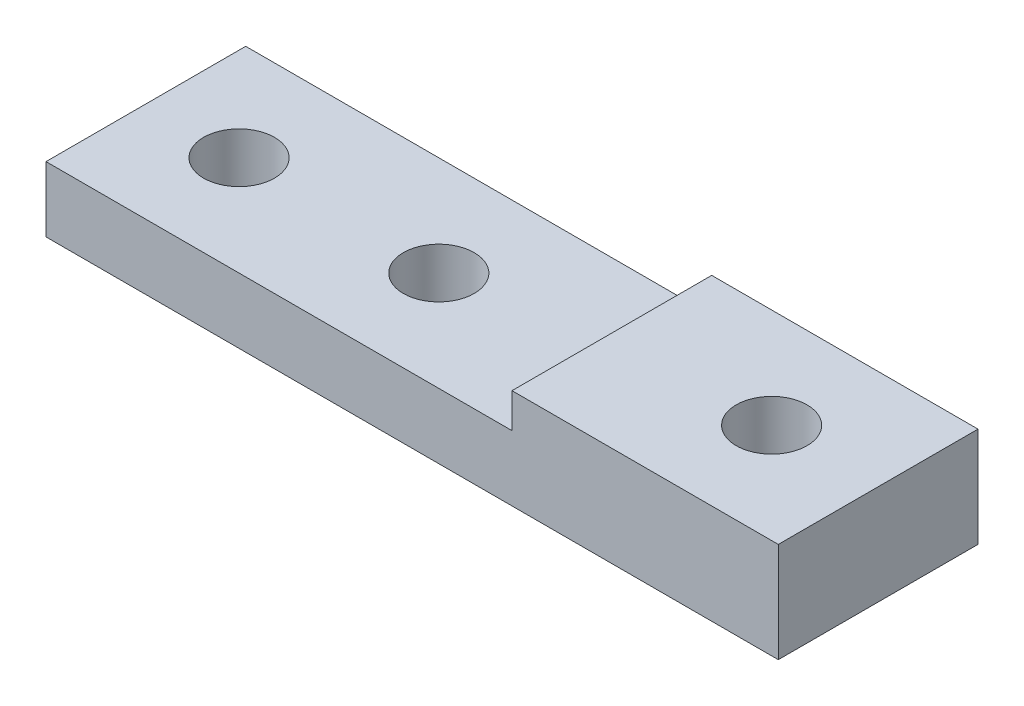
ISO-10303-21;
HEADER;
FILE_DESCRIPTION(('STEP AP214'),'2;1');
FILE_NAME('part.step','',(''),(''),'','','');
FILE_SCHEMA(('AUTOMOTIVE_DESIGN { 1 0 10303 214 1 1 1 1 }'));
ENDSEC;
DATA;
#1=APPLICATION_CONTEXT('core data for automotive mechanical design processes');
#2=APPLICATION_PROTOCOL_DEFINITION('international standard','automotive_design',2000,#1);
#3=PRODUCT_CONTEXT('',#1,'mechanical');
#4=PRODUCT('Part','Part','',(#3));
#5=PRODUCT_RELATED_PRODUCT_CATEGORY('part','',(#4));
#6=PRODUCT_DEFINITION_FORMATION('','',#4);
#7=PRODUCT_DEFINITION_CONTEXT('part definition',#1,'design');
#8=PRODUCT_DEFINITION('design','',#6,#7);
#9=PRODUCT_DEFINITION_SHAPE('','',#8);
#10=(LENGTH_UNIT() NAMED_UNIT(*) SI_UNIT(.MILLI.,.METRE.));
#11=(NAMED_UNIT(*) PLANE_ANGLE_UNIT() SI_UNIT($,.RADIAN.));
#12=(NAMED_UNIT(*) SI_UNIT($,.STERADIAN.) SOLID_ANGLE_UNIT());
#13=UNCERTAINTY_MEASURE_WITH_UNIT(LENGTH_MEASURE(1.E-05),#10,'distance_accuracy_value','');
#14=(GEOMETRIC_REPRESENTATION_CONTEXT(3) GLOBAL_UNCERTAINTY_ASSIGNED_CONTEXT((#13)) GLOBAL_UNIT_ASSIGNED_CONTEXT((#10,
#11,#12)) REPRESENTATION_CONTEXT('',''));
#15=CARTESIAN_POINT('',(0.,0.,0.));
#16=DIRECTION('',(0.,0.,1.));
#17=DIRECTION('',(1.,0.,0.));
#18=AXIS2_PLACEMENT_3D('',#15,#16,#17);
#19=CARTESIAN_POINT('',(-34.925,6.223,-9.525));
#20=DIRECTION('',(1.,0.,0.));
#21=DIRECTION('',(0.,0.,-1.));
#22=AXIS2_PLACEMENT_3D('',#19,#20,#21);
#23=PLANE('',#22);
#24=DIRECTION('',(0.,0.,1.));
#25=VECTOR('',#24,1.);
#26=CARTESIAN_POINT('',(-34.925,0.,-9.525));
#27=LINE('',#26,#25);
#28=CARTESIAN_POINT('',(-34.925,0.,-9.525));
#29=VERTEX_POINT('',#28);
#30=CARTESIAN_POINT('',(-34.925,0.,9.525));
#31=VERTEX_POINT('',#30);
#32=EDGE_CURVE('E101',#29,#31,#27,.T.);
#33=ORIENTED_EDGE('',*,*,#32,.T.);
#34=DIRECTION('',(0.,-1.,0.));
#35=VECTOR('',#34,1.);
#36=CARTESIAN_POINT('',(-34.925,6.223,9.525));
#37=LINE('',#36,#35);
#38=CARTESIAN_POINT('',(-34.925,6.223,9.525));
#39=VERTEX_POINT('',#38);
#40=EDGE_CURVE('E11',#39,#31,#37,.T.);
#41=ORIENTED_EDGE('',*,*,#40,.F.);
#42=DIRECTION('',(0.,0.,1.));
#43=VECTOR('',#42,1.);
#44=CARTESIAN_POINT('',(-34.925,6.223,-9.525));
#45=LINE('',#44,#43);
#46=CARTESIAN_POINT('',(-34.925,6.223,-9.525));
#47=VERTEX_POINT('',#46);
#48=EDGE_CURVE('E95',#47,#39,#45,.T.);
#49=ORIENTED_EDGE('',*,*,#48,.F.);
#50=DIRECTION('',(0.,-1.,0.));
#51=VECTOR('',#50,1.);
#52=CARTESIAN_POINT('',(-34.925,6.223,-9.525));
#53=LINE('',#52,#51);
#54=EDGE_CURVE('E86',#47,#29,#53,.T.);
#55=ORIENTED_EDGE('',*,*,#54,.T.);
#56=EDGE_LOOP('',(#33,#41,#49,#55));
#57=FACE_BOUND('',#56,.T.);
#58=ADVANCED_FACE('F43',(#57),#23,.F.);
#59=CARTESIAN_POINT('',(-34.925,6.223,9.525));
#60=DIRECTION('',(0.,0.,-1.));
#61=DIRECTION('',(-1.,0.,0.));
#62=AXIS2_PLACEMENT_3D('',#59,#60,#61);
#63=PLANE('',#62);
#64=DIRECTION('',(1.,0.,0.));
#65=VECTOR('',#64,1.);
#66=CARTESIAN_POINT('',(-34.925,0.,9.525));
#67=LINE('',#66,#65);
#68=CARTESIAN_POINT('',(34.925,0.,9.525));
#69=VERTEX_POINT('',#68);
#70=EDGE_CURVE('E105',#31,#69,#67,.T.);
#71=ORIENTED_EDGE('',*,*,#70,.T.);
#72=DIRECTION('',(0.,-1.,0.));
#73=VECTOR('',#72,1.);
#74=CARTESIAN_POINT('',(34.925,6.223,9.525));
#75=LINE('',#74,#73);
#76=CARTESIAN_POINT('',(34.925,9.525,9.525));
#77=VERTEX_POINT('',#76);
#78=EDGE_CURVE('E51',#77,#69,#75,.T.);
#79=ORIENTED_EDGE('',*,*,#78,.F.);
#80=DIRECTION('',(1.,0.,0.));
#81=VECTOR('',#80,1.);
#82=CARTESIAN_POINT('',(34.925,9.525,9.525));
#83=LINE('',#82,#81);
#84=CARTESIAN_POINT('',(9.52500000000001,9.525,9.525));
#85=VERTEX_POINT('',#84);
#86=EDGE_CURVE('E137',#85,#77,#83,.T.);
#87=ORIENTED_EDGE('',*,*,#86,.F.);
#88=DIRECTION('',(0.,-1.,0.));
#89=VECTOR('',#88,1.);
#90=CARTESIAN_POINT('',(9.52500000000001,9.525,9.525));
#91=LINE('',#90,#89);
#92=CARTESIAN_POINT('',(9.52500000000001,6.223,9.525));
#93=VERTEX_POINT('',#92);
#94=EDGE_CURVE('E114',#85,#93,#91,.T.);
#95=ORIENTED_EDGE('',*,*,#94,.T.);
#96=DIRECTION('',(1.,0.,0.));
#97=VECTOR('',#96,1.);
#98=CARTESIAN_POINT('',(-34.925,6.223,9.525));
#99=LINE('',#98,#97);
#100=EDGE_CURVE('E161',#39,#93,#99,.T.);
#101=ORIENTED_EDGE('',*,*,#100,.F.);
#102=ORIENTED_EDGE('',*,*,#40,.T.);
#103=EDGE_LOOP('',(#71,#79,#87,#95,#101,#102));
#104=FACE_BOUND('',#103,.T.);
#105=ADVANCED_FACE('F134',(#104),#63,.F.);
#106=CARTESIAN_POINT('',(34.925,6.223,-9.525));
#107=DIRECTION('',(-1.,0.,0.));
#108=DIRECTION('',(0.,0.,1.));
#109=AXIS2_PLACEMENT_3D('',#106,#107,#108);
#110=PLANE('',#109);
#111=DIRECTION('',(0.,0.,-1.));
#112=VECTOR('',#111,1.);
#113=CARTESIAN_POINT('',(34.925,0.,-9.525));
#114=LINE('',#113,#112);
#115=CARTESIAN_POINT('',(34.925,0.,-9.525));
#116=VERTEX_POINT('',#115);
#117=EDGE_CURVE('E96',#69,#116,#114,.T.);
#118=ORIENTED_EDGE('',*,*,#117,.T.);
#119=DIRECTION('',(0.,-1.,0.));
#120=VECTOR('',#119,1.);
#121=CARTESIAN_POINT('',(34.925,6.223,-9.525));
#122=LINE('',#121,#120);
#123=CARTESIAN_POINT('',(34.925,9.525,-9.525));
#124=VERTEX_POINT('',#123);
#125=EDGE_CURVE('E90',#124,#116,#122,.T.);
#126=ORIENTED_EDGE('',*,*,#125,.F.);
#127=DIRECTION('',(0.,0.,-1.));
#128=VECTOR('',#127,1.);
#129=CARTESIAN_POINT('',(34.925,9.525,-9.525));
#130=LINE('',#129,#128);
#131=EDGE_CURVE('E130',#77,#124,#130,.T.);
#132=ORIENTED_EDGE('',*,*,#131,.F.);
#133=ORIENTED_EDGE('',*,*,#78,.T.);
#134=EDGE_LOOP('',(#118,#126,#132,#133));
#135=FACE_BOUND('',#134,.T.);
#136=ADVANCED_FACE('F128',(#135),#110,.F.);
#137=CARTESIAN_POINT('',(-34.925,6.223,-9.525));
#138=DIRECTION('',(0.,0.,1.));
#139=DIRECTION('',(1.,0.,0.));
#140=AXIS2_PLACEMENT_3D('',#137,#138,#139);
#141=PLANE('',#140);
#142=DIRECTION('',(-1.,0.,0.));
#143=VECTOR('',#142,1.);
#144=CARTESIAN_POINT('',(-34.925,0.,-9.525));
#145=LINE('',#144,#143);
#146=EDGE_CURVE('E83',#116,#29,#145,.T.);
#147=ORIENTED_EDGE('',*,*,#146,.T.);
#148=ORIENTED_EDGE('',*,*,#54,.F.);
#149=DIRECTION('',(-1.,0.,0.));
#150=VECTOR('',#149,1.);
#151=CARTESIAN_POINT('',(-34.925,6.223,-9.525));
#152=LINE('',#151,#150);
#153=CARTESIAN_POINT('',(9.52500000000001,6.223,-9.525));
#154=VERTEX_POINT('',#153);
#155=EDGE_CURVE('E63',#154,#47,#152,.T.);
#156=ORIENTED_EDGE('',*,*,#155,.F.);
#157=DIRECTION('',(0.,-1.,0.));
#158=VECTOR('',#157,1.);
#159=CARTESIAN_POINT('',(9.52500000000001,9.525,-9.525));
#160=LINE('',#159,#158);
#161=CARTESIAN_POINT('',(9.52500000000001,9.525,-9.525));
#162=VERTEX_POINT('',#161);
#163=EDGE_CURVE('E107',#162,#154,#160,.T.);
#164=ORIENTED_EDGE('',*,*,#163,.F.);
#165=DIRECTION('',(-1.,0.,0.));
#166=VECTOR('',#165,1.);
#167=CARTESIAN_POINT('',(34.925,9.525,-9.525));
#168=LINE('',#167,#166);
#169=EDGE_CURVE('E153',#124,#162,#168,.T.);
#170=ORIENTED_EDGE('',*,*,#169,.F.);
#171=ORIENTED_EDGE('',*,*,#125,.T.);
#172=EDGE_LOOP('',(#147,#148,#156,#164,#170,#171));
#173=FACE_BOUND('',#172,.T.);
#174=ADVANCED_FACE('F85',(#173),#141,.F.);
#175=CARTESIAN_POINT('',(0.,6.223,0.));
#176=DIRECTION('',(0.,1.,0.));
#177=DIRECTION('',(0.,0.,1.));
#178=AXIS2_PLACEMENT_3D('',#175,#176,#177);
#179=PLANE('',#178);
#180=CARTESIAN_POINT('',(-6.98499999999999,6.223,0.));
#181=DIRECTION('',(0.,1.,0.));
#182=DIRECTION('',(0.,0.,1.));
#183=AXIS2_PLACEMENT_3D('',#180,#181,#182);
#184=CIRCLE('',#183,3.3782);
#185=CARTESIAN_POINT('',(-6.98499999999999,6.223,3.3782));
#186=VERTEX_POINT('',#185);
#187=EDGE_CURVE('E189',#186,#186,#184,.T.);
#188=ORIENTED_EDGE('',*,*,#187,.F.);
#189=EDGE_LOOP('',(#188));
#190=FACE_BOUND('',#189,.T.);
#191=CARTESIAN_POINT('',(-26.035,6.223,0.));
#192=DIRECTION('',(0.,1.,0.));
#193=DIRECTION('',(0.,0.,1.));
#194=AXIS2_PLACEMENT_3D('',#191,#192,#193);
#195=CIRCLE('',#194,3.3782);
#196=CARTESIAN_POINT('',(-26.035,6.223,3.3782));
#197=VERTEX_POINT('',#196);
#198=EDGE_CURVE('E158',#197,#197,#195,.T.);
#199=ORIENTED_EDGE('',*,*,#198,.F.);
#200=EDGE_LOOP('',(#199));
#201=FACE_BOUND('',#200,.T.);
#202=DIRECTION('',(0.,0.,1.));
#203=VECTOR('',#202,1.);
#204=CARTESIAN_POINT('',(9.52500000000001,6.223,-9.525));
#205=LINE('',#204,#203);
#206=EDGE_CURVE('E58',#154,#93,#205,.T.);
#207=ORIENTED_EDGE('',*,*,#206,.F.);
#208=ORIENTED_EDGE('',*,*,#155,.T.);
#209=ORIENTED_EDGE('',*,*,#48,.T.);
#210=ORIENTED_EDGE('',*,*,#100,.T.);
#211=EDGE_LOOP('',(#207,#208,#209,#210));
#212=FACE_BOUND('',#211,.T.);
#213=ADVANCED_FACE('F169',(#190,#201,#212),#179,.T.);
#214=CARTESIAN_POINT('',(0.,0.,0.));
#215=DIRECTION('',(0.,1.,0.));
#216=DIRECTION('',(0.,0.,1.));
#217=AXIS2_PLACEMENT_3D('',#214,#215,#216);
#218=PLANE('',#217);
#219=CARTESIAN_POINT('',(24.765,0.,0.));
#220=DIRECTION('',(0.,-1.,0.));
#221=DIRECTION('',(0.,0.,-1.));
#222=AXIS2_PLACEMENT_3D('',#219,#220,#221);
#223=CIRCLE('',#222,3.3782);
#224=CARTESIAN_POINT('',(24.765,0.,-3.3782));
#225=VERTEX_POINT('',#224);
#226=EDGE_CURVE('E201',#225,#225,#223,.T.);
#227=ORIENTED_EDGE('',*,*,#226,.F.);
#228=EDGE_LOOP('',(#227));
#229=FACE_BOUND('',#228,.T.);
#230=CARTESIAN_POINT('',(-6.98499999999999,0.,0.));
#231=DIRECTION('',(0.,-1.,0.));
#232=DIRECTION('',(0.,0.,-1.));
#233=AXIS2_PLACEMENT_3D('',#230,#231,#232);
#234=CIRCLE('',#233,3.3782);
#235=CARTESIAN_POINT('',(-6.98499999999999,0.,-3.3782));
#236=VERTEX_POINT('',#235);
#237=EDGE_CURVE('E193',#236,#236,#234,.T.);
#238=ORIENTED_EDGE('',*,*,#237,.F.);
#239=EDGE_LOOP('',(#238));
#240=FACE_BOUND('',#239,.T.);
#241=CARTESIAN_POINT('',(-26.035,0.,0.));
#242=DIRECTION('',(0.,-1.,0.));
#243=DIRECTION('',(0.,0.,-1.));
#244=AXIS2_PLACEMENT_3D('',#241,#242,#243);
#245=CIRCLE('',#244,3.3782);
#246=CARTESIAN_POINT('',(-26.035,0.,-3.3782));
#247=VERTEX_POINT('',#246);
#248=EDGE_CURVE('E185',#247,#247,#245,.T.);
#249=ORIENTED_EDGE('',*,*,#248,.F.);
#250=EDGE_LOOP('',(#249));
#251=FACE_BOUND('',#250,.T.);
#252=ORIENTED_EDGE('',*,*,#32,.F.);
#253=ORIENTED_EDGE('',*,*,#146,.F.);
#254=ORIENTED_EDGE('',*,*,#117,.F.);
#255=ORIENTED_EDGE('',*,*,#70,.F.);
#256=EDGE_LOOP('',(#252,#253,#254,#255));
#257=FACE_BOUND('',#256,.T.);
#258=ADVANCED_FACE('F104',(#229,#240,#251,#257),#218,.F.);
#259=CARTESIAN_POINT('',(9.52500000000001,9.525,-9.525));
#260=DIRECTION('',(1.,0.,0.));
#261=DIRECTION('',(0.,0.,-1.));
#262=AXIS2_PLACEMENT_3D('',#259,#260,#261);
#263=PLANE('',#262);
#264=ORIENTED_EDGE('',*,*,#206,.T.);
#265=ORIENTED_EDGE('',*,*,#94,.F.);
#266=DIRECTION('',(0.,0.,1.));
#267=VECTOR('',#266,1.);
#268=CARTESIAN_POINT('',(9.52500000000001,9.525,-9.525));
#269=LINE('',#268,#267);
#270=EDGE_CURVE('E145',#162,#85,#269,.T.);
#271=ORIENTED_EDGE('',*,*,#270,.F.);
#272=ORIENTED_EDGE('',*,*,#163,.T.);
#273=EDGE_LOOP('',(#264,#265,#271,#272));
#274=FACE_BOUND('',#273,.T.);
#275=ADVANCED_FACE('F171',(#274),#263,.F.);
#276=CARTESIAN_POINT('',(0.,9.525,0.));
#277=DIRECTION('',(0.,-1.,0.));
#278=DIRECTION('',(0.,0.,-1.));
#279=AXIS2_PLACEMENT_3D('',#276,#277,#278);
#280=PLANE('',#279);
#281=CARTESIAN_POINT('',(24.765,9.525,0.));
#282=DIRECTION('',(0.,-1.,0.));
#283=DIRECTION('',(0.,0.,-1.));
#284=AXIS2_PLACEMENT_3D('',#281,#282,#283);
#285=CIRCLE('',#284,3.3782);
#286=CARTESIAN_POINT('',(24.765,9.525,-3.3782));
#287=VERTEX_POINT('',#286);
#288=EDGE_CURVE('E197',#287,#287,#285,.T.);
#289=ORIENTED_EDGE('',*,*,#288,.T.);
#290=EDGE_LOOP('',(#289));
#291=FACE_BOUND('',#290,.T.);
#292=ORIENTED_EDGE('',*,*,#131,.T.);
#293=ORIENTED_EDGE('',*,*,#169,.T.);
#294=ORIENTED_EDGE('',*,*,#270,.T.);
#295=ORIENTED_EDGE('',*,*,#86,.T.);
#296=EDGE_LOOP('',(#292,#293,#294,#295));
#297=FACE_BOUND('',#296,.T.);
#298=ADVANCED_FACE('F141',(#291,#297),#280,.F.);
#299=CARTESIAN_POINT('',(-26.035,0.,0.));
#300=DIRECTION('',(0.,-1.,0.));
#301=DIRECTION('',(0.,0.,-1.));
#302=AXIS2_PLACEMENT_3D('',#299,#300,#301);
#303=CYLINDRICAL_SURFACE('',#302,3.3782);
#304=ORIENTED_EDGE('',*,*,#198,.T.);
#305=EDGE_LOOP('',(#304));
#306=FACE_BOUND('',#305,.T.);
#307=ORIENTED_EDGE('',*,*,#248,.T.);
#308=EDGE_LOOP('',(#307));
#309=FACE_BOUND('',#308,.T.);
#310=ADVANCED_FACE('F216',(#306,#309),#303,.F.);
#311=CARTESIAN_POINT('',(-6.98499999999999,0.,0.));
#312=DIRECTION('',(0.,-1.,0.));
#313=DIRECTION('',(0.,0.,-1.));
#314=AXIS2_PLACEMENT_3D('',#311,#312,#313);
#315=CYLINDRICAL_SURFACE('',#314,3.3782);
#316=ORIENTED_EDGE('',*,*,#187,.T.);
#317=EDGE_LOOP('',(#316));
#318=FACE_BOUND('',#317,.T.);
#319=ORIENTED_EDGE('',*,*,#237,.T.);
#320=EDGE_LOOP('',(#319));
#321=FACE_BOUND('',#320,.T.);
#322=ADVANCED_FACE('F218',(#318,#321),#315,.F.);
#323=CARTESIAN_POINT('',(24.765,0.,0.));
#324=DIRECTION('',(0.,-1.,0.));
#325=DIRECTION('',(0.,0.,-1.));
#326=AXIS2_PLACEMENT_3D('',#323,#324,#325);
#327=CYLINDRICAL_SURFACE('',#326,3.3782);
#328=ORIENTED_EDGE('',*,*,#288,.F.);
#329=EDGE_LOOP('',(#328));
#330=FACE_BOUND('',#329,.T.);
#331=ORIENTED_EDGE('',*,*,#226,.T.);
#332=EDGE_LOOP('',(#331));
#333=FACE_BOUND('',#332,.T.);
#334=ADVANCED_FACE('F207',(#330,#333),#327,.F.);
#335=CLOSED_SHELL('',(#58,#105,#136,#174,#213,#258,#275,#298,#310,#322,#334));
#336=MANIFOLD_SOLID_BREP('B2',#335);
#337=ADVANCED_BREP_SHAPE_REPRESENTATION('',(#18,#336),#14);
#338=SHAPE_DEFINITION_REPRESENTATION(#9,#337);
ENDSEC;
END-ISO-10303-21;
